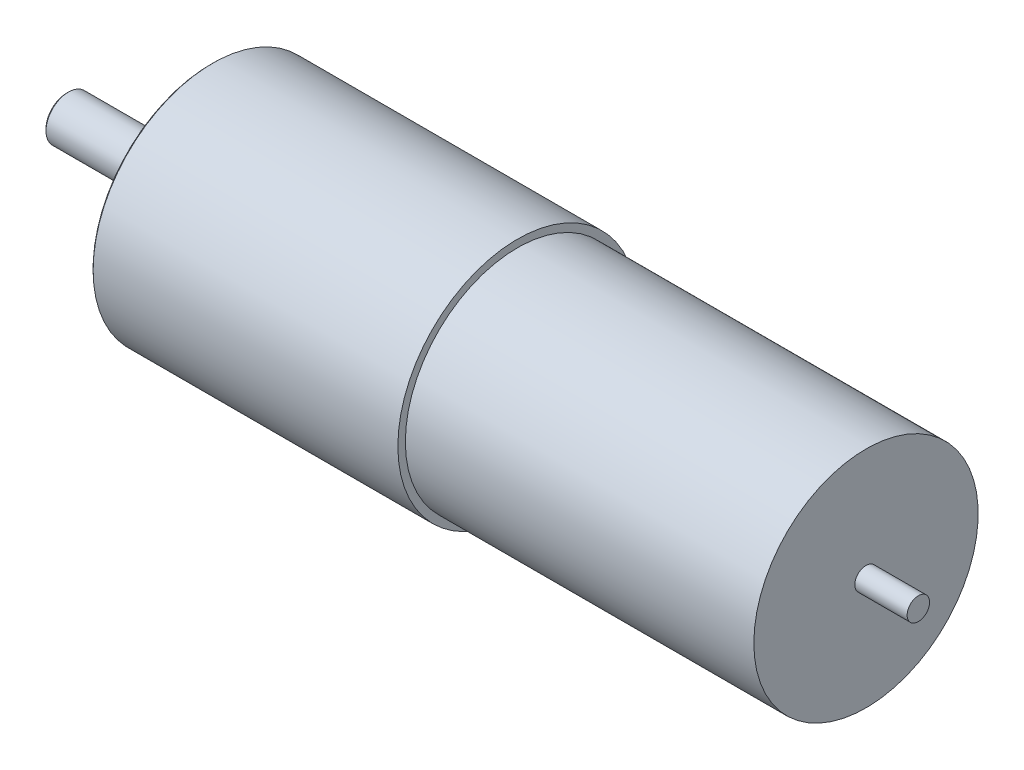
ISO-10303-21;
HEADER;
FILE_DESCRIPTION(('STEP AP214'),'2;1');
FILE_NAME('part.step','',(''),(''),'','','');
FILE_SCHEMA(('AUTOMOTIVE_DESIGN { 1 0 10303 214 1 1 1 1 }'));
ENDSEC;
DATA;
#1=APPLICATION_CONTEXT('core data for automotive mechanical design processes');
#2=APPLICATION_PROTOCOL_DEFINITION('international standard','automotive_design',2000,#1);
#3=PRODUCT_CONTEXT('',#1,'mechanical');
#4=PRODUCT('Part','Part','',(#3));
#5=PRODUCT_RELATED_PRODUCT_CATEGORY('part','',(#4));
#6=PRODUCT_DEFINITION_FORMATION('','',#4);
#7=PRODUCT_DEFINITION_CONTEXT('part definition',#1,'design');
#8=PRODUCT_DEFINITION('design','',#6,#7);
#9=PRODUCT_DEFINITION_SHAPE('','',#8);
#10=(LENGTH_UNIT() NAMED_UNIT(*) SI_UNIT(.MILLI.,.METRE.));
#11=(NAMED_UNIT(*) PLANE_ANGLE_UNIT() SI_UNIT($,.RADIAN.));
#12=(NAMED_UNIT(*) SI_UNIT($,.STERADIAN.) SOLID_ANGLE_UNIT());
#13=UNCERTAINTY_MEASURE_WITH_UNIT(LENGTH_MEASURE(1.E-05),#10,'distance_accuracy_value','');
#14=(GEOMETRIC_REPRESENTATION_CONTEXT(3) GLOBAL_UNCERTAINTY_ASSIGNED_CONTEXT((#13)) GLOBAL_UNIT_ASSIGNED_CONTEXT((#10,
#11,#12)) REPRESENTATION_CONTEXT('',''));
#15=CARTESIAN_POINT('',(0.,0.,0.));
#16=DIRECTION('',(0.,0.,1.));
#17=DIRECTION('',(1.,0.,0.));
#18=AXIS2_PLACEMENT_3D('',#15,#16,#17);
#19=CARTESIAN_POINT('',(0.,0.,0.));
#20=DIRECTION('',(-1.,0.,0.));
#21=DIRECTION('',(0.,0.,1.));
#22=AXIS2_PLACEMENT_3D('',#19,#20,#21);
#23=CYLINDRICAL_SURFACE('',#22,10.);
#24=CARTESIAN_POINT('',(19.3,0.,0.));
#25=DIRECTION('',(-1.,0.,0.));
#26=DIRECTION('',(0.,0.,1.));
#27=AXIS2_PLACEMENT_3D('',#24,#25,#26);
#28=CIRCLE('',#27,10.);
#29=CARTESIAN_POINT('',(19.3,-9.,4.35889894354067));
#30=VERTEX_POINT('',#29);
#31=CARTESIAN_POINT('',(19.3,9.,4.35889894354067));
#32=VERTEX_POINT('',#31);
#33=EDGE_CURVE('E205',#30,#32,#28,.T.);
#34=ORIENTED_EDGE('',*,*,#33,.T.);
#35=DIRECTION('',(-1.,0.,0.));
#36=VECTOR('',#35,1.);
#37=CARTESIAN_POINT('',(0.,9.,4.35889894354068));
#38=LINE('',#37,#36);
#39=CARTESIAN_POINT('',(16.3,9.,4.35889894354068));
#40=VERTEX_POINT('',#39);
#41=EDGE_CURVE('E173',#32,#40,#38,.T.);
#42=ORIENTED_EDGE('',*,*,#41,.T.);
#43=CARTESIAN_POINT('',(16.3,0.,0.));
#44=DIRECTION('',(-1.,0.,0.));
#45=DIRECTION('',(0.,0.,1.));
#46=AXIS2_PLACEMENT_3D('',#43,#44,#45);
#47=CIRCLE('',#46,10.);
#48=CARTESIAN_POINT('',(16.3,-9.,4.35889894354067));
#49=VERTEX_POINT('',#48);
#50=EDGE_CURVE('E210',#49,#40,#47,.T.);
#51=ORIENTED_EDGE('',*,*,#50,.F.);
#52=DIRECTION('',(-1.,0.,0.));
#53=VECTOR('',#52,1.);
#54=CARTESIAN_POINT('',(0.,-9.,4.35889894354067));
#55=LINE('',#54,#53);
#56=EDGE_CURVE('E159',#49,#30,#55,.F.);
#57=ORIENTED_EDGE('',*,*,#56,.T.);
#58=EDGE_LOOP('',(#34,#42,#51,#57));
#59=FACE_BOUND('',#58,.T.);
#60=ADVANCED_FACE('F42',(#59),#23,.T.);
#61=CARTESIAN_POINT('',(0.,0.,0.));
#62=DIRECTION('',(1.,0.,0.));
#63=DIRECTION('',(0.,0.,-1.));
#64=AXIS2_PLACEMENT_3D('',#61,#62,#63);
#65=PLANE('',#64);
#66=DIRECTION('',(0.,1.,0.));
#67=VECTOR('',#66,1.);
#68=CARTESIAN_POINT('',(0.,-16.,-2.5));
#69=LINE('',#68,#67);
#70=CARTESIAN_POINT('',(0.,-1.14564392373897,-2.5));
#71=VERTEX_POINT('',#70);
#72=CARTESIAN_POINT('',(0.,1.14564392373897,-2.5));
#73=VERTEX_POINT('',#72);
#74=EDGE_CURVE('E177',#71,#73,#69,.T.);
#75=ORIENTED_EDGE('',*,*,#74,.F.);
#76=CARTESIAN_POINT('',(0.,0.,0.));
#77=DIRECTION('',(1.,0.,0.));
#78=DIRECTION('',(0.,0.,-1.));
#79=AXIS2_PLACEMENT_3D('',#76,#77,#78);
#80=CIRCLE('',#79,2.75);
#81=EDGE_CURVE('E229',#71,#73,#80,.F.);
#82=ORIENTED_EDGE('',*,*,#81,.T.);
#83=EDGE_LOOP('',(#75,#82));
#84=FACE_BOUND('',#83,.T.);
#85=ADVANCED_FACE('F297',(#84),#65,.F.);
#86=CARTESIAN_POINT('',(0.,0.,0.));
#87=DIRECTION('',(-1.,0.,0.));
#88=DIRECTION('',(0.,0.,1.));
#89=AXIS2_PLACEMENT_3D('',#86,#87,#88);
#90=CYLINDRICAL_SURFACE('',#89,3.);
#91=DIRECTION('',(-1.,0.,0.));
#92=VECTOR('',#91,1.);
#93=CARTESIAN_POINT('',(0.,1.6583123951777,-2.5));
#94=LINE('',#93,#92);
#95=CARTESIAN_POINT('',(12.,1.6583123951777,-2.5));
#96=VERTEX_POINT('',#95);
#97=CARTESIAN_POINT('',(0.250000000000008,1.6583123951777,-2.5));
#98=VERTEX_POINT('',#97);
#99=EDGE_CURVE('E225',#96,#98,#94,.T.);
#100=ORIENTED_EDGE('',*,*,#99,.T.);
#101=CARTESIAN_POINT('',(0.250000000000008,0.,0.));
#102=DIRECTION('',(1.,0.,0.));
#103=DIRECTION('',(0.,0.,-1.));
#104=AXIS2_PLACEMENT_3D('',#101,#102,#103);
#105=CIRCLE('',#104,3.);
#106=CARTESIAN_POINT('',(0.250000000000008,-1.6583123951777,-2.5));
#107=VERTEX_POINT('',#106);
#108=EDGE_CURVE('E310',#98,#107,#105,.T.);
#109=ORIENTED_EDGE('',*,*,#108,.T.);
#110=DIRECTION('',(-1.,0.,0.));
#111=VECTOR('',#110,1.);
#112=CARTESIAN_POINT('',(0.,-1.6583123951777,-2.5));
#113=LINE('',#112,#111);
#114=CARTESIAN_POINT('',(12.,-1.6583123951777,-2.5));
#115=VERTEX_POINT('',#114);
#116=EDGE_CURVE('E219',#107,#115,#113,.F.);
#117=ORIENTED_EDGE('',*,*,#116,.T.);
#118=CARTESIAN_POINT('',(12.,0.,0.));
#119=DIRECTION('',(1.,0.,0.));
#120=DIRECTION('',(0.,0.,-1.));
#121=AXIS2_PLACEMENT_3D('',#118,#119,#120);
#122=CIRCLE('',#121,3.);
#123=EDGE_CURVE('E222',#115,#96,#122,.T.);
#124=ORIENTED_EDGE('',*,*,#123,.T.);
#125=EDGE_LOOP('',(#100,#109,#117,#124));
#126=FACE_BOUND('',#125,.T.);
#127=CARTESIAN_POINT('',(16.3,0.,0.));
#128=DIRECTION('',(-1.,0.,0.));
#129=DIRECTION('',(0.,0.,1.));
#130=AXIS2_PLACEMENT_3D('',#127,#128,#129);
#131=CIRCLE('',#130,3.);
#132=CARTESIAN_POINT('',(16.3,0.,3.));
#133=VERTEX_POINT('',#132);
#134=EDGE_CURVE('E215',#133,#133,#131,.T.);
#135=ORIENTED_EDGE('',*,*,#134,.T.);
#136=EDGE_LOOP('',(#135));
#137=FACE_BOUND('',#136,.T.);
#138=ADVANCED_FACE('F294',(#126,#137),#90,.T.);
#139=CARTESIAN_POINT('',(16.3,0.,-3.));
#140=DIRECTION('',(1.,0.,0.));
#141=DIRECTION('',(0.,0.,-1.));
#142=AXIS2_PLACEMENT_3D('',#139,#140,#141);
#143=PLANE('',#142);
#144=ORIENTED_EDGE('',*,*,#134,.F.);
#145=EDGE_LOOP('',(#144));
#146=FACE_BOUND('',#145,.T.);
#147=ORIENTED_EDGE('',*,*,#50,.T.);
#148=DIRECTION('',(0.,0.,1.));
#149=VECTOR('',#148,1.);
#150=CARTESIAN_POINT('',(16.3,9.,10.));
#151=LINE('',#150,#149);
#152=CARTESIAN_POINT('',(16.3,9.,-4.35889894354068));
#153=VERTEX_POINT('',#152);
#154=EDGE_CURVE('E154',#153,#40,#151,.T.);
#155=ORIENTED_EDGE('',*,*,#154,.F.);
#156=CARTESIAN_POINT('',(16.3,-9.,-4.35889894354068));
#157=VERTEX_POINT('',#156);
#158=EDGE_CURVE('E214',#153,#157,#47,.T.);
#159=ORIENTED_EDGE('',*,*,#158,.T.);
#160=DIRECTION('',(0.,0.,-1.));
#161=VECTOR('',#160,1.);
#162=CARTESIAN_POINT('',(16.3,-9.,-10.));
#163=LINE('',#162,#161);
#164=EDGE_CURVE('E153',#49,#157,#163,.T.);
#165=ORIENTED_EDGE('',*,*,#164,.F.);
#166=EDGE_LOOP('',(#147,#155,#159,#165));
#167=FACE_BOUND('',#166,.T.);
#168=ADVANCED_FACE('F290',(#146,#167),#143,.F.);
#169=ORIENTED_EDGE('',*,*,#158,.F.);
#170=DIRECTION('',(-1.,0.,0.));
#171=VECTOR('',#170,1.);
#172=CARTESIAN_POINT('',(0.,9.,-4.35889894354068));
#173=LINE('',#172,#171);
#174=CARTESIAN_POINT('',(19.3,9.,-4.35889894354068));
#175=VERTEX_POINT('',#174);
#176=EDGE_CURVE('E170',#153,#175,#173,.F.);
#177=ORIENTED_EDGE('',*,*,#176,.T.);
#178=CARTESIAN_POINT('',(19.3,-9.,-4.35889894354068));
#179=VERTEX_POINT('',#178);
#180=EDGE_CURVE('E209',#175,#179,#28,.T.);
#181=ORIENTED_EDGE('',*,*,#180,.T.);
#182=DIRECTION('',(-1.,0.,0.));
#183=VECTOR('',#182,1.);
#184=CARTESIAN_POINT('',(0.,-9.,-4.35889894354068));
#185=LINE('',#184,#183);
#186=EDGE_CURVE('E166',#179,#157,#185,.T.);
#187=ORIENTED_EDGE('',*,*,#186,.T.);
#188=EDGE_LOOP('',(#169,#177,#181,#187));
#189=FACE_BOUND('',#188,.T.);
#190=ADVANCED_FACE('F286',(#189),#23,.T.);
#191=CARTESIAN_POINT('',(19.3,0.,-10.));
#192=DIRECTION('',(1.,0.,0.));
#193=DIRECTION('',(0.,0.,-1.));
#194=AXIS2_PLACEMENT_3D('',#191,#192,#193);
#195=PLANE('',#194);
#196=CARTESIAN_POINT('',(19.3,-9.19238815542517,-9.19238815542455));
#197=DIRECTION('',(-1.,0.,0.));
#198=DIRECTION('',(0.,0.,1.));
#199=AXIS2_PLACEMENT_3D('',#196,#197,#198);
#200=CIRCLE('',#199,1.24999999999999);
#201=CARTESIAN_POINT('',(19.3,-9.19238815542517,-7.94238815542457));
#202=VERTEX_POINT('',#201);
#203=EDGE_CURVE('E124',#202,#202,#200,.T.);
#204=ORIENTED_EDGE('',*,*,#203,.F.);
#205=EDGE_LOOP('',(#204));
#206=FACE_BOUND('',#205,.T.);
#207=CARTESIAN_POINT('',(19.3,9.19238815542506,-9.19238815542517));
#208=DIRECTION('',(-1.,0.,0.));
#209=DIRECTION('',(0.,0.,1.));
#210=AXIS2_PLACEMENT_3D('',#207,#208,#209);
#211=CIRCLE('',#210,1.24999999999999);
#212=CARTESIAN_POINT('',(19.3,9.19238815542506,-7.94238815542518));
#213=VERTEX_POINT('',#212);
#214=EDGE_CURVE('E123',#213,#213,#211,.T.);
#215=ORIENTED_EDGE('',*,*,#214,.F.);
#216=EDGE_LOOP('',(#215));
#217=FACE_BOUND('',#216,.T.);
#218=CARTESIAN_POINT('',(19.3,9.19238815542568,9.19238815542507));
#219=DIRECTION('',(-1.,0.,0.));
#220=DIRECTION('',(0.,0.,1.));
#221=AXIS2_PLACEMENT_3D('',#218,#219,#220);
#222=CIRCLE('',#221,1.24999999999999);
#223=CARTESIAN_POINT('',(19.3,9.19238815542568,10.4423881554251));
#224=VERTEX_POINT('',#223);
#225=EDGE_CURVE('E137',#224,#224,#222,.T.);
#226=ORIENTED_EDGE('',*,*,#225,.F.);
#227=EDGE_LOOP('',(#226));
#228=FACE_BOUND('',#227,.T.);
#229=CARTESIAN_POINT('',(19.3,-9.19238815542455,9.19238815542568));
#230=DIRECTION('',(-1.,0.,0.));
#231=DIRECTION('',(0.,0.,1.));
#232=AXIS2_PLACEMENT_3D('',#229,#230,#231);
#233=CIRCLE('',#232,1.24999999999999);
#234=CARTESIAN_POINT('',(19.3,-9.19238815542455,10.4423881554257));
#235=VERTEX_POINT('',#234);
#236=EDGE_CURVE('E145',#235,#235,#233,.T.);
#237=ORIENTED_EDGE('',*,*,#236,.F.);
#238=EDGE_LOOP('',(#237));
#239=FACE_BOUND('',#238,.T.);
#240=ORIENTED_EDGE('',*,*,#180,.F.);
#241=DIRECTION('',(0.,0.,1.));
#242=VECTOR('',#241,1.);
#243=CARTESIAN_POINT('',(19.3,9.,10.));
#244=LINE('',#243,#242);
#245=EDGE_CURVE('E66',#175,#32,#244,.T.);
#246=ORIENTED_EDGE('',*,*,#245,.T.);
#247=ORIENTED_EDGE('',*,*,#33,.F.);
#248=DIRECTION('',(0.,0.,-1.));
#249=VECTOR('',#248,1.);
#250=CARTESIAN_POINT('',(19.3,-9.,-10.));
#251=LINE('',#250,#249);
#252=EDGE_CURVE('E58',#30,#179,#251,.T.);
#253=ORIENTED_EDGE('',*,*,#252,.T.);
#254=EDGE_LOOP('',(#240,#246,#247,#253));
#255=FACE_BOUND('',#254,.T.);
#256=CARTESIAN_POINT('',(19.3,0.,0.));
#257=DIRECTION('',(1.,0.,0.));
#258=DIRECTION('',(0.,0.,-1.));
#259=AXIS2_PLACEMENT_3D('',#256,#257,#258);
#260=CIRCLE('',#259,15.75);
#261=CARTESIAN_POINT('',(19.3,0.,-15.75));
#262=VERTEX_POINT('',#261);
#263=EDGE_CURVE('E51',#262,#262,#260,.F.);
#264=ORIENTED_EDGE('',*,*,#263,.T.);
#265=EDGE_LOOP('',(#264));
#266=FACE_BOUND('',#265,.T.);
#267=ADVANCED_FACE('F282',(#206,#217,#228,#239,#255,#266),#195,.F.);
#268=CARTESIAN_POINT('',(0.,0.,0.));
#269=DIRECTION('',(-1.,0.,0.));
#270=DIRECTION('',(0.,0.,1.));
#271=AXIS2_PLACEMENT_3D('',#268,#269,#270);
#272=CYLINDRICAL_SURFACE('',#271,16.);
#273=CARTESIAN_POINT('',(19.55,0.,0.));
#274=DIRECTION('',(1.,0.,0.));
#275=DIRECTION('',(0.,0.,-1.));
#276=AXIS2_PLACEMENT_3D('',#273,#274,#275);
#277=CIRCLE('',#276,16.);
#278=CARTESIAN_POINT('',(19.55,0.,-16.));
#279=VERTEX_POINT('',#278);
#280=EDGE_CURVE('E11',#279,#279,#277,.T.);
#281=ORIENTED_EDGE('',*,*,#280,.T.);
#282=EDGE_LOOP('',(#281));
#283=FACE_BOUND('',#282,.T.);
#284=CARTESIAN_POINT('',(60.3,0.,0.));
#285=DIRECTION('',(-1.,0.,0.));
#286=DIRECTION('',(0.,0.,1.));
#287=AXIS2_PLACEMENT_3D('',#284,#285,#286);
#288=CIRCLE('',#287,16.);
#289=CARTESIAN_POINT('',(60.3,0.,16.));
#290=VERTEX_POINT('',#289);
#291=EDGE_CURVE('E201',#290,#290,#288,.T.);
#292=ORIENTED_EDGE('',*,*,#291,.T.);
#293=EDGE_LOOP('',(#292));
#294=FACE_BOUND('',#293,.T.);
#295=ADVANCED_FACE('F278',(#283,#294),#272,.T.);
#296=CARTESIAN_POINT('',(60.3,0.,-16.));
#297=DIRECTION('',(-1.,0.,0.));
#298=DIRECTION('',(0.,0.,1.));
#299=AXIS2_PLACEMENT_3D('',#296,#297,#298);
#300=PLANE('',#299);
#301=ORIENTED_EDGE('',*,*,#291,.F.);
#302=EDGE_LOOP('',(#301));
#303=FACE_BOUND('',#302,.T.);
#304=CARTESIAN_POINT('',(60.3,0.,0.));
#305=DIRECTION('',(-1.,0.,0.));
#306=DIRECTION('',(0.,0.,1.));
#307=AXIS2_PLACEMENT_3D('',#304,#305,#306);
#308=CIRCLE('',#307,15.);
#309=CARTESIAN_POINT('',(60.3,0.,15.));
#310=VERTEX_POINT('',#309);
#311=EDGE_CURVE('E197',#310,#310,#308,.T.);
#312=ORIENTED_EDGE('',*,*,#311,.T.);
#313=EDGE_LOOP('',(#312));
#314=FACE_BOUND('',#313,.T.);
#315=ADVANCED_FACE('F274',(#303,#314),#300,.F.);
#316=CARTESIAN_POINT('',(0.,0.,0.));
#317=DIRECTION('',(-1.,0.,0.));
#318=DIRECTION('',(0.,0.,1.));
#319=AXIS2_PLACEMENT_3D('',#316,#317,#318);
#320=CYLINDRICAL_SURFACE('',#319,15.);
#321=ORIENTED_EDGE('',*,*,#311,.F.);
#322=EDGE_LOOP('',(#321));
#323=FACE_BOUND('',#322,.T.);
#324=CARTESIAN_POINT('',(106.9,0.,0.));
#325=DIRECTION('',(-1.,0.,0.));
#326=DIRECTION('',(0.,0.,1.));
#327=AXIS2_PLACEMENT_3D('',#324,#325,#326);
#328=CIRCLE('',#327,15.);
#329=CARTESIAN_POINT('',(106.9,0.,15.));
#330=VERTEX_POINT('',#329);
#331=EDGE_CURVE('E193',#330,#330,#328,.T.);
#332=ORIENTED_EDGE('',*,*,#331,.T.);
#333=EDGE_LOOP('',(#332));
#334=FACE_BOUND('',#333,.T.);
#335=ADVANCED_FACE('F270',(#323,#334),#320,.T.);
#336=CARTESIAN_POINT('',(106.9,0.,-15.));
#337=DIRECTION('',(-1.,0.,0.));
#338=DIRECTION('',(0.,0.,1.));
#339=AXIS2_PLACEMENT_3D('',#336,#337,#338);
#340=PLANE('',#339);
#341=ORIENTED_EDGE('',*,*,#331,.F.);
#342=EDGE_LOOP('',(#341));
#343=FACE_BOUND('',#342,.T.);
#344=CARTESIAN_POINT('',(106.9,0.,0.));
#345=DIRECTION('',(-1.,0.,0.));
#346=DIRECTION('',(0.,0.,1.));
#347=AXIS2_PLACEMENT_3D('',#344,#345,#346);
#348=CIRCLE('',#347,1.5);
#349=CARTESIAN_POINT('',(106.9,0.,1.5));
#350=VERTEX_POINT('',#349);
#351=EDGE_CURVE('E189',#350,#350,#348,.T.);
#352=ORIENTED_EDGE('',*,*,#351,.T.);
#353=EDGE_LOOP('',(#352));
#354=FACE_BOUND('',#353,.T.);
#355=ADVANCED_FACE('F266',(#343,#354),#340,.F.);
#356=CARTESIAN_POINT('',(0.,0.,0.));
#357=DIRECTION('',(-1.,0.,0.));
#358=DIRECTION('',(0.,0.,1.));
#359=AXIS2_PLACEMENT_3D('',#356,#357,#358);
#360=CYLINDRICAL_SURFACE('',#359,1.5);
#361=ORIENTED_EDGE('',*,*,#351,.F.);
#362=EDGE_LOOP('',(#361));
#363=FACE_BOUND('',#362,.T.);
#364=CARTESIAN_POINT('',(113.9,0.,0.));
#365=DIRECTION('',(-1.,0.,0.));
#366=DIRECTION('',(0.,0.,1.));
#367=AXIS2_PLACEMENT_3D('',#364,#365,#366);
#368=CIRCLE('',#367,1.5);
#369=CARTESIAN_POINT('',(113.9,0.,1.5));
#370=VERTEX_POINT('',#369);
#371=EDGE_CURVE('E182',#370,#370,#368,.T.);
#372=ORIENTED_EDGE('',*,*,#371,.T.);
#373=EDGE_LOOP('',(#372));
#374=FACE_BOUND('',#373,.T.);
#375=ADVANCED_FACE('F262',(#363,#374),#360,.T.);
#376=CARTESIAN_POINT('',(113.9,0.,-1.5));
#377=DIRECTION('',(-1.,0.,0.));
#378=DIRECTION('',(0.,0.,1.));
#379=AXIS2_PLACEMENT_3D('',#376,#377,#378);
#380=PLANE('',#379);
#381=ORIENTED_EDGE('',*,*,#371,.F.);
#382=EDGE_LOOP('',(#381));
#383=FACE_BOUND('',#382,.T.);
#384=ADVANCED_FACE('F258',(#383),#380,.F.);
#385=CARTESIAN_POINT('',(12.,-16.,-3.));
#386=DIRECTION('',(1.,0.,0.));
#387=DIRECTION('',(0.,0.,-1.));
#388=AXIS2_PLACEMENT_3D('',#385,#386,#387);
#389=PLANE('',#388);
#390=ORIENTED_EDGE('',*,*,#123,.F.);
#391=DIRECTION('',(0.,1.,0.));
#392=VECTOR('',#391,1.);
#393=CARTESIAN_POINT('',(12.,-16.,-2.5));
#394=LINE('',#393,#392);
#395=EDGE_CURVE('E178',#115,#96,#394,.T.);
#396=ORIENTED_EDGE('',*,*,#395,.T.);
#397=EDGE_LOOP('',(#390,#396));
#398=FACE_BOUND('',#397,.T.);
#399=ADVANCED_FACE('F255',(#398),#389,.F.);
#400=CARTESIAN_POINT('',(0.,-16.,-2.5));
#401=DIRECTION('',(0.,0.,1.));
#402=DIRECTION('',(1.,0.,0.));
#403=AXIS2_PLACEMENT_3D('',#400,#401,#402);
#404=PLANE('',#403);
#405=ORIENTED_EDGE('',*,*,#74,.T.);
#406=CARTESIAN_POINT('',(0.,1.14564392373897,-2.5));
#407=CARTESIAN_POINT('',(0.0182988419726119,1.18956321617483,-2.5));
#408=CARTESIAN_POINT('',(0.0373330393267836,1.23317079639272,-2.5));
#409=CARTESIAN_POINT('',(0.076705341761392,1.31975438176403,-2.5));
#410=CARTESIAN_POINT('',(0.0970424512109185,1.36273083903957,-2.5));
#411=CARTESIAN_POINT('',(0.138879666552043,1.44810578748741,-2.5));
#412=CARTESIAN_POINT('',(0.160379649464327,1.49050433918451,-2.5));
#413=CARTESIAN_POINT('',(0.204433946626094,1.57479149276021,-2.5));
#414=CARTESIAN_POINT('',(0.226989045176052,1.61667968515748,-2.5));
#415=CARTESIAN_POINT('',(0.250000000000008,1.6583123951777,-2.5));
#416=B_SPLINE_CURVE_WITH_KNOTS('',3,(#406,#407,#408,#409,#410,#411,#412,#413,#414,#415),
.UNSPECIFIED.,.F.,.F.,(4,2,2,2,4),(0.,0.142722943356321,0.285338095483309,0.427938194768135,
0.570646031905142),.UNSPECIFIED.);
#417=EDGE_CURVE('E241',#73,#98,#416,.T.);
#418=ORIENTED_EDGE('',*,*,#417,.T.);
#419=ORIENTED_EDGE('',*,*,#99,.F.);
#420=ORIENTED_EDGE('',*,*,#395,.F.);
#421=ORIENTED_EDGE('',*,*,#116,.F.);
#422=CARTESIAN_POINT('',(0.250000000000008,-1.6583123951777,-2.5));
#423=CARTESIAN_POINT('',(0.226989045176052,-1.61667968515748,-2.5));
#424=CARTESIAN_POINT('',(0.204433946626094,-1.57479149276021,-2.5));
#425=CARTESIAN_POINT('',(0.160379649464327,-1.49050433918451,-2.5));
#426=CARTESIAN_POINT('',(0.138879666552043,-1.44810578748741,-2.5));
#427=CARTESIAN_POINT('',(0.0970424512109185,-1.36273083903957,-2.5));
#428=CARTESIAN_POINT('',(0.0767053417613919,-1.31975438176403,-2.5));
#429=CARTESIAN_POINT('',(0.0373330393267837,-1.23317079639272,-2.5));
#430=CARTESIAN_POINT('',(0.018298841972612,-1.18956321617484,-2.5));
#431=CARTESIAN_POINT('',(0.,-1.14564392373897,-2.5));
#432=B_SPLINE_CURVE_WITH_KNOTS('',3,(#422,#423,#424,#425,#426,#427,#428,#429,#430,#431),
.UNSPECIFIED.,.F.,.F.,(4,2,2,2,4),(0.,0.142707837137006,0.285307936421832,0.427923088548821,
0.570646031905141),.UNSPECIFIED.);
#433=EDGE_CURVE('E233',#107,#71,#432,.T.);
#434=ORIENTED_EDGE('',*,*,#433,.T.);
#435=EDGE_LOOP('',(#405,#418,#419,#420,#421,#434));
#436=FACE_BOUND('',#435,.T.);
#437=ADVANCED_FACE('F250',(#436),#404,.F.);
#438=CARTESIAN_POINT('',(0.,0.,0.));
#439=DIRECTION('',(1.,0.,0.));
#440=DIRECTION('',(0.,0.,-1.));
#441=AXIS2_PLACEMENT_3D('',#438,#439,#440);
#442=CONICAL_SURFACE('',#441,2.75,0.785398163397428);
#443=ORIENTED_EDGE('',*,*,#433,.F.);
#444=ORIENTED_EDGE('',*,*,#108,.F.);
#445=ORIENTED_EDGE('',*,*,#417,.F.);
#446=ORIENTED_EDGE('',*,*,#81,.F.);
#447=EDGE_LOOP('',(#443,#444,#445,#446));
#448=FACE_BOUND('',#447,.T.);
#449=ADVANCED_FACE('F247',(#448),#442,.T.);
#450=CARTESIAN_POINT('',(19.3,0.,0.));
#451=DIRECTION('',(1.,0.,0.));
#452=DIRECTION('',(0.,0.,-1.));
#453=AXIS2_PLACEMENT_3D('',#450,#451,#452);
#454=CONICAL_SURFACE('',#453,15.75,0.785398163397448);
#455=ORIENTED_EDGE('',*,*,#280,.F.);
#456=EDGE_LOOP('',(#455));
#457=FACE_BOUND('',#456,.T.);
#458=ORIENTED_EDGE('',*,*,#263,.F.);
#459=EDGE_LOOP('',(#458));
#460=FACE_BOUND('',#459,.T.);
#461=ADVANCED_FACE('F44',(#457,#460),#454,.T.);
#462=CARTESIAN_POINT('',(39.3997512422418,-9.,-10.));
#463=DIRECTION('',(0.,1.,0.));
#464=DIRECTION('',(0.,0.,1.));
#465=AXIS2_PLACEMENT_3D('',#462,#463,#464);
#466=PLANE('',#465);
#467=ORIENTED_EDGE('',*,*,#252,.F.);
#468=ORIENTED_EDGE('',*,*,#56,.F.);
#469=ORIENTED_EDGE('',*,*,#164,.T.);
#470=ORIENTED_EDGE('',*,*,#186,.F.);
#471=EDGE_LOOP('',(#467,#468,#469,#470));
#472=FACE_BOUND('',#471,.T.);
#473=ADVANCED_FACE('F321',(#472),#466,.F.);
#474=CARTESIAN_POINT('',(39.3997512422418,9.,10.));
#475=DIRECTION('',(0.,-1.,0.));
#476=DIRECTION('',(0.,0.,-1.));
#477=AXIS2_PLACEMENT_3D('',#474,#475,#476);
#478=PLANE('',#477);
#479=ORIENTED_EDGE('',*,*,#245,.F.);
#480=ORIENTED_EDGE('',*,*,#176,.F.);
#481=ORIENTED_EDGE('',*,*,#154,.T.);
#482=ORIENTED_EDGE('',*,*,#41,.F.);
#483=EDGE_LOOP('',(#479,#480,#481,#482));
#484=FACE_BOUND('',#483,.T.);
#485=ADVANCED_FACE('F327',(#484),#478,.F.);
#486=CARTESIAN_POINT('',(24.8,-9.19238815542455,9.19238815542568));
#487=DIRECTION('',(-1.,0.,0.));
#488=DIRECTION('',(0.,0.,1.));
#489=AXIS2_PLACEMENT_3D('',#486,#487,#488);
#490=CONICAL_SURFACE('',#489,1.25,1.02974425867665);
#491=CARTESIAN_POINT('',(25.5510757737845,-9.19238815542456,9.19238815542568));
#492=VERTEX_POINT('',#491);
#493=VERTEX_LOOP('',#492);
#494=FACE_BOUND('',#493,.T.);
#495=CARTESIAN_POINT('',(24.8,-9.19238815542455,9.19238815542568));
#496=DIRECTION('',(-1.,0.,0.));
#497=DIRECTION('',(0.,0.,1.));
#498=AXIS2_PLACEMENT_3D('',#495,#496,#497);
#499=CIRCLE('',#498,1.25);
#500=CARTESIAN_POINT('',(24.8,-9.19238815542455,10.4423881554257));
#501=VERTEX_POINT('',#500);
#502=EDGE_CURVE('E149',#501,#501,#499,.T.);
#503=ORIENTED_EDGE('',*,*,#502,.T.);
#504=EDGE_LOOP('',(#503));
#505=FACE_BOUND('',#504,.T.);
#506=ADVANCED_FACE('F452',(#494,#505),#490,.F.);
#507=CARTESIAN_POINT('',(19.3,-9.19238815542455,9.19238815542568));
#508=DIRECTION('',(-1.,0.,0.));
#509=DIRECTION('',(0.,0.,1.));
#510=AXIS2_PLACEMENT_3D('',#507,#508,#509);
#511=CYLINDRICAL_SURFACE('',#510,1.24999999999999);
#512=ORIENTED_EDGE('',*,*,#502,.F.);
#513=EDGE_LOOP('',(#512));
#514=FACE_BOUND('',#513,.T.);
#515=ORIENTED_EDGE('',*,*,#236,.T.);
#516=EDGE_LOOP('',(#515));
#517=FACE_BOUND('',#516,.T.);
#518=ADVANCED_FACE('F459',(#514,#517),#511,.F.);
#519=CARTESIAN_POINT('',(24.8,9.19238815542568,9.19238815542507));
#520=DIRECTION('',(-1.,0.,0.));
#521=DIRECTION('',(0.,0.,1.));
#522=AXIS2_PLACEMENT_3D('',#519,#520,#521);
#523=CONICAL_SURFACE('',#522,1.25,1.02974425867665);
#524=CARTESIAN_POINT('',(25.5510757737845,9.19238815542568,9.19238815542507));
#525=VERTEX_POINT('',#524);
#526=VERTEX_LOOP('',#525);
#527=FACE_BOUND('',#526,.T.);
#528=CARTESIAN_POINT('',(24.8,9.19238815542568,9.19238815542507));
#529=DIRECTION('',(-1.,0.,0.));
#530=DIRECTION('',(0.,0.,1.));
#531=AXIS2_PLACEMENT_3D('',#528,#529,#530);
#532=CIRCLE('',#531,1.25);
#533=CARTESIAN_POINT('',(24.8,9.19238815542568,10.4423881554251));
#534=VERTEX_POINT('',#533);
#535=EDGE_CURVE('E141',#534,#534,#532,.T.);
#536=ORIENTED_EDGE('',*,*,#535,.T.);
#537=EDGE_LOOP('',(#536));
#538=FACE_BOUND('',#537,.T.);
#539=ADVANCED_FACE('F468',(#527,#538),#523,.F.);
#540=CARTESIAN_POINT('',(19.3,9.19238815542568,9.19238815542507));
#541=DIRECTION('',(-1.,0.,0.));
#542=DIRECTION('',(0.,0.,1.));
#543=AXIS2_PLACEMENT_3D('',#540,#541,#542);
#544=CYLINDRICAL_SURFACE('',#543,1.24999999999999);
#545=ORIENTED_EDGE('',*,*,#535,.F.);
#546=EDGE_LOOP('',(#545));
#547=FACE_BOUND('',#546,.T.);
#548=ORIENTED_EDGE('',*,*,#225,.T.);
#549=EDGE_LOOP('',(#548));
#550=FACE_BOUND('',#549,.T.);
#551=ADVANCED_FACE('F478',(#547,#550),#544,.F.);
#552=CARTESIAN_POINT('',(24.8,9.19238815542506,-9.19238815542517));
#553=DIRECTION('',(-1.,0.,0.));
#554=DIRECTION('',(0.,0.,1.));
#555=AXIS2_PLACEMENT_3D('',#552,#553,#554);
#556=CONICAL_SURFACE('',#555,1.25,1.02974425867665);
#557=CARTESIAN_POINT('',(25.5510757737845,9.19238815542506,-9.19238815542517));
#558=VERTEX_POINT('',#557);
#559=VERTEX_LOOP('',#558);
#560=FACE_BOUND('',#559,.T.);
#561=CARTESIAN_POINT('',(24.8,9.19238815542506,-9.19238815542517));
#562=DIRECTION('',(-1.,0.,0.));
#563=DIRECTION('',(0.,0.,1.));
#564=AXIS2_PLACEMENT_3D('',#561,#562,#563);
#565=CIRCLE('',#564,1.25);
#566=CARTESIAN_POINT('',(24.8,9.19238815542506,-7.94238815542517));
#567=VERTEX_POINT('',#566);
#568=EDGE_CURVE('E129',#567,#567,#565,.T.);
#569=ORIENTED_EDGE('',*,*,#568,.T.);
#570=EDGE_LOOP('',(#569));
#571=FACE_BOUND('',#570,.T.);
#572=ADVANCED_FACE('F487',(#560,#571),#556,.F.);
#573=CARTESIAN_POINT('',(19.3,9.19238815542506,-9.19238815542517));
#574=DIRECTION('',(-1.,0.,0.));
#575=DIRECTION('',(0.,0.,1.));
#576=AXIS2_PLACEMENT_3D('',#573,#574,#575);
#577=CYLINDRICAL_SURFACE('',#576,1.24999999999999);
#578=ORIENTED_EDGE('',*,*,#568,.F.);
#579=EDGE_LOOP('',(#578));
#580=FACE_BOUND('',#579,.T.);
#581=ORIENTED_EDGE('',*,*,#214,.T.);
#582=EDGE_LOOP('',(#581));
#583=FACE_BOUND('',#582,.T.);
#584=ADVANCED_FACE('F116',(#580,#583),#577,.F.);
#585=CARTESIAN_POINT('',(24.8,-9.19238815542517,-9.19238815542455));
#586=DIRECTION('',(-1.,0.,0.));
#587=DIRECTION('',(0.,0.,1.));
#588=AXIS2_PLACEMENT_3D('',#585,#586,#587);
#589=CONICAL_SURFACE('',#588,1.25,1.02974425867665);
#590=CARTESIAN_POINT('',(25.5510757737845,-9.19238815542517,-9.19238815542455));
#591=VERTEX_POINT('',#590);
#592=VERTEX_LOOP('',#591);
#593=FACE_BOUND('',#592,.T.);
#594=CARTESIAN_POINT('',(24.8,-9.19238815542517,-9.19238815542455));
#595=DIRECTION('',(-1.,0.,0.));
#596=DIRECTION('',(0.,0.,1.));
#597=AXIS2_PLACEMENT_3D('',#594,#595,#596);
#598=CIRCLE('',#597,1.25);
#599=CARTESIAN_POINT('',(24.8,-9.19238815542517,-7.94238815542456));
#600=VERTEX_POINT('',#599);
#601=EDGE_CURVE('E120',#600,#600,#598,.T.);
#602=ORIENTED_EDGE('',*,*,#601,.T.);
#603=EDGE_LOOP('',(#602));
#604=FACE_BOUND('',#603,.T.);
#605=ADVANCED_FACE('F112',(#593,#604),#589,.F.);
#606=CARTESIAN_POINT('',(19.3,-9.19238815542517,-9.19238815542455));
#607=DIRECTION('',(-1.,0.,0.));
#608=DIRECTION('',(0.,0.,1.));
#609=AXIS2_PLACEMENT_3D('',#606,#607,#608);
#610=CYLINDRICAL_SURFACE('',#609,1.24999999999999);
#611=ORIENTED_EDGE('',*,*,#601,.F.);
#612=EDGE_LOOP('',(#611));
#613=FACE_BOUND('',#612,.T.);
#614=ORIENTED_EDGE('',*,*,#203,.T.);
#615=EDGE_LOOP('',(#614));
#616=FACE_BOUND('',#615,.T.);
#617=ADVANCED_FACE('F115',(#613,#616),#610,.F.);
#618=CLOSED_SHELL('',(#60,#85,#138,#168,#190,#267,#295,#315,#335,#355,#375,#384,#399,#437,#449,
#461,#473,#485,#506,#518,#539,#551,#572,#584,#605,#617));
#619=MANIFOLD_SOLID_BREP('B2',#618);
#620=ADVANCED_BREP_SHAPE_REPRESENTATION('',(#18,#619),#14);
#621=SHAPE_DEFINITION_REPRESENTATION(#9,#620);
ENDSEC;
END-ISO-10303-21;
